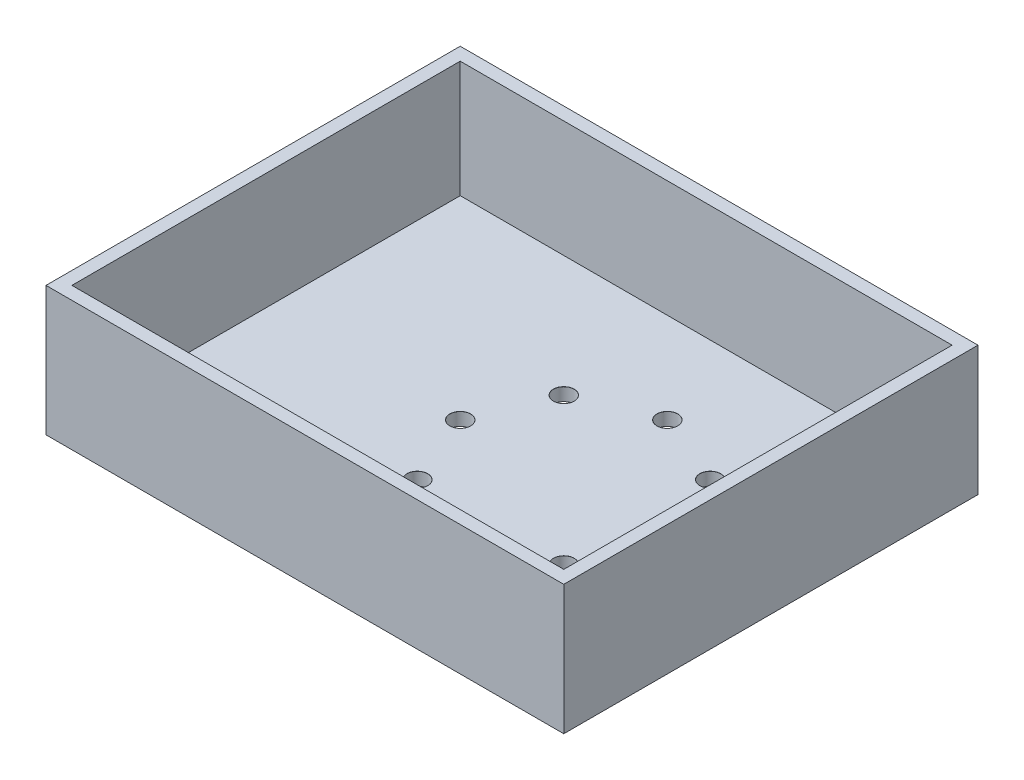
ISO-10303-21;
HEADER;
FILE_DESCRIPTION(('STEP AP214'),'2;1');
FILE_NAME('part.step','',(''),(''),'','','');
FILE_SCHEMA(('AUTOMOTIVE_DESIGN { 1 0 10303 214 1 1 1 1 }'));
ENDSEC;
DATA;
#1=APPLICATION_CONTEXT('core data for automotive mechanical design processes');
#2=APPLICATION_PROTOCOL_DEFINITION('international standard','automotive_design',2000,#1);
#3=PRODUCT_CONTEXT('',#1,'mechanical');
#4=PRODUCT('Part','Part','',(#3));
#5=PRODUCT_RELATED_PRODUCT_CATEGORY('part','',(#4));
#6=PRODUCT_DEFINITION_FORMATION('','',#4);
#7=PRODUCT_DEFINITION_CONTEXT('part definition',#1,'design');
#8=PRODUCT_DEFINITION('design','',#6,#7);
#9=PRODUCT_DEFINITION_SHAPE('','',#8);
#10=(LENGTH_UNIT() NAMED_UNIT(*) SI_UNIT(.MILLI.,.METRE.));
#11=(NAMED_UNIT(*) PLANE_ANGLE_UNIT() SI_UNIT($,.RADIAN.));
#12=(NAMED_UNIT(*) SI_UNIT($,.STERADIAN.) SOLID_ANGLE_UNIT());
#13=UNCERTAINTY_MEASURE_WITH_UNIT(LENGTH_MEASURE(1.E-05),#10,'distance_accuracy_value','');
#14=(GEOMETRIC_REPRESENTATION_CONTEXT(3) GLOBAL_UNCERTAINTY_ASSIGNED_CONTEXT((#13)) GLOBAL_UNIT_ASSIGNED_CONTEXT((#10,
#11,#12)) REPRESENTATION_CONTEXT('',''));
#15=CARTESIAN_POINT('',(0.,0.,0.));
#16=DIRECTION('',(0.,0.,1.));
#17=DIRECTION('',(1.,0.,0.));
#18=AXIS2_PLACEMENT_3D('',#15,#16,#17);
#19=CARTESIAN_POINT('',(0.,50.,160.));
#20=DIRECTION('',(0.,-1.,0.));
#21=DIRECTION('',(1.,0.,0.));
#22=AXIS2_PLACEMENT_3D('',#19,#20,#21);
#23=PLANE('',#22);
#24=DIRECTION('',(-1.,0.,0.));
#25=VECTOR('',#24,1.);
#26=CARTESIAN_POINT('',(0.,50.,0.));
#27=LINE('',#26,#25);
#28=CARTESIAN_POINT('',(0.,50.,0.));
#29=VERTEX_POINT('',#28);
#30=CARTESIAN_POINT('',(-200.,50.,0.));
#31=VERTEX_POINT('',#30);
#32=EDGE_CURVE('E168',#29,#31,#27,.T.);
#33=ORIENTED_EDGE('',*,*,#32,.T.);
#34=DIRECTION('',(0.,0.,-1.));
#35=VECTOR('',#34,1.);
#36=CARTESIAN_POINT('',(-200.,50.,160.));
#37=LINE('',#36,#35);
#38=CARTESIAN_POINT('',(-200.,50.,160.));
#39=VERTEX_POINT('',#38);
#40=EDGE_CURVE('E48',#39,#31,#37,.T.);
#41=ORIENTED_EDGE('',*,*,#40,.F.);
#42=DIRECTION('',(-1.,0.,0.));
#43=VECTOR('',#42,1.);
#44=CARTESIAN_POINT('',(0.,50.,160.));
#45=LINE('',#44,#43);
#46=CARTESIAN_POINT('',(0.,50.,160.));
#47=VERTEX_POINT('',#46);
#48=EDGE_CURVE('E92',#47,#39,#45,.T.);
#49=ORIENTED_EDGE('',*,*,#48,.F.);
#50=DIRECTION('',(0.,0.,-1.));
#51=VECTOR('',#50,1.);
#52=CARTESIAN_POINT('',(0.,50.,160.));
#53=LINE('',#52,#51);
#54=EDGE_CURVE('E11',#47,#29,#53,.T.);
#55=ORIENTED_EDGE('',*,*,#54,.T.);
#56=EDGE_LOOP('',(#33,#41,#49,#55));
#57=FACE_BOUND('',#56,.T.);
#58=DIRECTION('',(-1.,0.,0.));
#59=VECTOR('',#58,1.);
#60=CARTESIAN_POINT('',(0.,50.,5.));
#61=LINE('',#60,#59);
#62=CARTESIAN_POINT('',(-5.,50.,5.));
#63=VERTEX_POINT('',#62);
#64=CARTESIAN_POINT('',(-195.,50.,5.));
#65=VERTEX_POINT('',#64);
#66=EDGE_CURVE('E136',#63,#65,#61,.T.);
#67=ORIENTED_EDGE('',*,*,#66,.F.);
#68=DIRECTION('',(0.,0.,-1.));
#69=VECTOR('',#68,1.);
#70=CARTESIAN_POINT('',(-5.,50.,160.));
#71=LINE('',#70,#69);
#72=CARTESIAN_POINT('',(-5.,50.,155.));
#73=VERTEX_POINT('',#72);
#74=EDGE_CURVE('E135',#73,#63,#71,.T.);
#75=ORIENTED_EDGE('',*,*,#74,.F.);
#76=DIRECTION('',(-1.,0.,0.));
#77=VECTOR('',#76,1.);
#78=CARTESIAN_POINT('',(0.,50.,155.));
#79=LINE('',#78,#77);
#80=CARTESIAN_POINT('',(-195.,50.,155.));
#81=VERTEX_POINT('',#80);
#82=EDGE_CURVE('E145',#73,#81,#79,.T.);
#83=ORIENTED_EDGE('',*,*,#82,.T.);
#84=DIRECTION('',(0.,0.,-1.));
#85=VECTOR('',#84,1.);
#86=CARTESIAN_POINT('',(-195.,50.,160.));
#87=LINE('',#86,#85);
#88=EDGE_CURVE('E150',#81,#65,#87,.T.);
#89=ORIENTED_EDGE('',*,*,#88,.T.);
#90=EDGE_LOOP('',(#67,#75,#83,#89));
#91=FACE_BOUND('',#90,.T.);
#92=ADVANCED_FACE('F40',(#57,#91),#23,.F.);
#93=CARTESIAN_POINT('',(0.,0.,160.));
#94=DIRECTION('',(-1.,0.,0.));
#95=DIRECTION('',(0.,0.,1.));
#96=AXIS2_PLACEMENT_3D('',#93,#94,#95);
#97=PLANE('',#96);
#98=DIRECTION('',(0.,1.,0.));
#99=VECTOR('',#98,1.);
#100=CARTESIAN_POINT('',(0.,0.,0.));
#101=LINE('',#100,#99);
#102=CARTESIAN_POINT('',(0.,0.,0.));
#103=VERTEX_POINT('',#102);
#104=EDGE_CURVE('E153',#103,#29,#101,.T.);
#105=ORIENTED_EDGE('',*,*,#104,.T.);
#106=ORIENTED_EDGE('',*,*,#54,.F.);
#107=DIRECTION('',(0.,1.,0.));
#108=VECTOR('',#107,1.);
#109=CARTESIAN_POINT('',(0.,0.,160.));
#110=LINE('',#109,#108);
#111=CARTESIAN_POINT('',(0.,0.,160.));
#112=VERTEX_POINT('',#111);
#113=EDGE_CURVE('E159',#112,#47,#110,.T.);
#114=ORIENTED_EDGE('',*,*,#113,.F.);
#115=DIRECTION('',(0.,0.,-1.));
#116=VECTOR('',#115,1.);
#117=CARTESIAN_POINT('',(0.,0.,160.));
#118=LINE('',#117,#116);
#119=EDGE_CURVE('E165',#112,#103,#118,.T.);
#120=ORIENTED_EDGE('',*,*,#119,.T.);
#121=EDGE_LOOP('',(#105,#106,#114,#120));
#122=FACE_BOUND('',#121,.T.);
#123=ADVANCED_FACE('F42',(#122),#97,.F.);
#124=CARTESIAN_POINT('',(-200.,0.,160.));
#125=DIRECTION('',(1.,0.,0.));
#126=DIRECTION('',(0.,0.,-1.));
#127=AXIS2_PLACEMENT_3D('',#124,#125,#126);
#128=PLANE('',#127);
#129=DIRECTION('',(0.,-1.,0.));
#130=VECTOR('',#129,1.);
#131=CARTESIAN_POINT('',(-200.,0.,0.));
#132=LINE('',#131,#130);
#133=CARTESIAN_POINT('',(-200.,0.,0.));
#134=VERTEX_POINT('',#133);
#135=EDGE_CURVE('E170',#31,#134,#132,.T.);
#136=ORIENTED_EDGE('',*,*,#135,.T.);
#137=DIRECTION('',(0.,0.,-1.));
#138=VECTOR('',#137,1.);
#139=CARTESIAN_POINT('',(-200.,0.,160.));
#140=LINE('',#139,#138);
#141=CARTESIAN_POINT('',(-200.,0.,160.));
#142=VERTEX_POINT('',#141);
#143=EDGE_CURVE('E174',#142,#134,#140,.T.);
#144=ORIENTED_EDGE('',*,*,#143,.F.);
#145=DIRECTION('',(0.,-1.,0.));
#146=VECTOR('',#145,1.);
#147=CARTESIAN_POINT('',(-200.,0.,160.));
#148=LINE('',#147,#146);
#149=EDGE_CURVE('E162',#39,#142,#148,.T.);
#150=ORIENTED_EDGE('',*,*,#149,.F.);
#151=ORIENTED_EDGE('',*,*,#40,.T.);
#152=EDGE_LOOP('',(#136,#144,#150,#151));
#153=FACE_BOUND('',#152,.T.);
#154=ADVANCED_FACE('F179',(#153),#128,.F.);
#155=CARTESIAN_POINT('',(0.,0.,160.));
#156=DIRECTION('',(0.,1.,0.));
#157=DIRECTION('',(-1.,0.,0.));
#158=AXIS2_PLACEMENT_3D('',#155,#156,#157);
#159=PLANE('',#158);
#160=CARTESIAN_POINT('',(-108.284271247462,0.,51.7157287525378));
#161=DIRECTION('',(0.,1.,0.));
#162=DIRECTION('',(0.,0.,1.));
#163=AXIS2_PLACEMENT_3D('',#160,#161,#162);
#164=CIRCLE('',#163,4.);
#165=CARTESIAN_POINT('',(-108.284271247462,0.,55.7157287525378));
#166=VERTEX_POINT('',#165);
#167=EDGE_CURVE('E303',#166,#166,#164,.T.);
#168=ORIENTED_EDGE('',*,*,#167,.T.);
#169=EDGE_LOOP('',(#168));
#170=FACE_BOUND('',#169,.T.);
#171=CARTESIAN_POINT('',(-120.,0.,79.9999999999996));
#172=DIRECTION('',(0.,1.,0.));
#173=DIRECTION('',(0.,0.,1.));
#174=AXIS2_PLACEMENT_3D('',#171,#172,#173);
#175=CIRCLE('',#174,4.);
#176=CARTESIAN_POINT('',(-120.,0.,83.9999999999996));
#177=VERTEX_POINT('',#176);
#178=EDGE_CURVE('E313',#177,#177,#175,.T.);
#179=ORIENTED_EDGE('',*,*,#178,.T.);
#180=EDGE_LOOP('',(#179));
#181=FACE_BOUND('',#180,.T.);
#182=CARTESIAN_POINT('',(-108.284271247462,0.,108.284271247462));
#183=DIRECTION('',(0.,1.,0.));
#184=DIRECTION('',(0.,0.,1.));
#185=AXIS2_PLACEMENT_3D('',#182,#183,#184);
#186=CIRCLE('',#185,4.);
#187=CARTESIAN_POINT('',(-108.284271247462,0.,112.284271247462));
#188=VERTEX_POINT('',#187);
#189=EDGE_CURVE('E322',#188,#188,#186,.T.);
#190=ORIENTED_EDGE('',*,*,#189,.T.);
#191=EDGE_LOOP('',(#190));
#192=FACE_BOUND('',#191,.T.);
#193=CARTESIAN_POINT('',(-80.,0.,120.));
#194=DIRECTION('',(0.,1.,0.));
#195=DIRECTION('',(0.,0.,1.));
#196=AXIS2_PLACEMENT_3D('',#193,#194,#195);
#197=CIRCLE('',#196,4.);
#198=CARTESIAN_POINT('',(-80.,0.,124.));
#199=VERTEX_POINT('',#198);
#200=EDGE_CURVE('E331',#199,#199,#197,.T.);
#201=ORIENTED_EDGE('',*,*,#200,.T.);
#202=EDGE_LOOP('',(#201));
#203=FACE_BOUND('',#202,.T.);
#204=CARTESIAN_POINT('',(-51.7157287525382,0.,108.284271247462));
#205=DIRECTION('',(0.,1.,0.));
#206=DIRECTION('',(0.,0.,1.));
#207=AXIS2_PLACEMENT_3D('',#204,#205,#206);
#208=CIRCLE('',#207,4.);
#209=CARTESIAN_POINT('',(-51.7157287525382,0.,112.284271247462));
#210=VERTEX_POINT('',#209);
#211=EDGE_CURVE('E340',#210,#210,#208,.T.);
#212=ORIENTED_EDGE('',*,*,#211,.T.);
#213=EDGE_LOOP('',(#212));
#214=FACE_BOUND('',#213,.T.);
#215=CARTESIAN_POINT('',(-40.,0.,80.0000000000001));
#216=DIRECTION('',(0.,1.,0.));
#217=DIRECTION('',(0.,0.,1.));
#218=AXIS2_PLACEMENT_3D('',#215,#216,#217);
#219=CIRCLE('',#218,4.);
#220=CARTESIAN_POINT('',(-40.,0.,84.0000000000001));
#221=VERTEX_POINT('',#220);
#222=EDGE_CURVE('E349',#221,#221,#219,.T.);
#223=ORIENTED_EDGE('',*,*,#222,.T.);
#224=EDGE_LOOP('',(#223));
#225=FACE_BOUND('',#224,.T.);
#226=CARTESIAN_POINT('',(-51.715728752538,0.,51.7157287525381));
#227=DIRECTION('',(0.,1.,0.));
#228=DIRECTION('',(0.,0.,1.));
#229=AXIS2_PLACEMENT_3D('',#226,#227,#228);
#230=CIRCLE('',#229,4.);
#231=CARTESIAN_POINT('',(-51.715728752538,0.,55.7157287525381));
#232=VERTEX_POINT('',#231);
#233=EDGE_CURVE('E358',#232,#232,#230,.T.);
#234=ORIENTED_EDGE('',*,*,#233,.T.);
#235=EDGE_LOOP('',(#234));
#236=FACE_BOUND('',#235,.T.);
#237=CARTESIAN_POINT('',(-80.,0.,40.));
#238=DIRECTION('',(0.,1.,0.));
#239=DIRECTION('',(0.,0.,1.));
#240=AXIS2_PLACEMENT_3D('',#237,#238,#239);
#241=CIRCLE('',#240,4.);
#242=CARTESIAN_POINT('',(-80.,0.,44.));
#243=VERTEX_POINT('',#242);
#244=EDGE_CURVE('E137',#243,#243,#241,.T.);
#245=ORIENTED_EDGE('',*,*,#244,.T.);
#246=EDGE_LOOP('',(#245));
#247=FACE_BOUND('',#246,.T.);
#248=DIRECTION('',(1.,0.,0.));
#249=VECTOR('',#248,1.);
#250=CARTESIAN_POINT('',(0.,0.,0.));
#251=LINE('',#250,#249);
#252=EDGE_CURVE('E85',#134,#103,#251,.T.);
#253=ORIENTED_EDGE('',*,*,#252,.T.);
#254=ORIENTED_EDGE('',*,*,#119,.F.);
#255=DIRECTION('',(1.,0.,0.));
#256=VECTOR('',#255,1.);
#257=CARTESIAN_POINT('',(0.,0.,160.));
#258=LINE('',#257,#256);
#259=EDGE_CURVE('E64',#142,#112,#258,.T.);
#260=ORIENTED_EDGE('',*,*,#259,.F.);
#261=ORIENTED_EDGE('',*,*,#143,.T.);
#262=EDGE_LOOP('',(#253,#254,#260,#261));
#263=FACE_BOUND('',#262,.T.);
#264=ADVANCED_FACE('F187',(#170,#181,#192,#203,#214,#225,#236,#247,#263),#159,.F.);
#265=CARTESIAN_POINT('',(0.,0.,160.));
#266=DIRECTION('',(0.,0.,1.));
#267=DIRECTION('',(1.,0.,0.));
#268=AXIS2_PLACEMENT_3D('',#265,#266,#267);
#269=PLANE('',#268);
#270=ORIENTED_EDGE('',*,*,#113,.T.);
#271=ORIENTED_EDGE('',*,*,#48,.T.);
#272=ORIENTED_EDGE('',*,*,#149,.T.);
#273=ORIENTED_EDGE('',*,*,#259,.T.);
#274=EDGE_LOOP('',(#270,#271,#272,#273));
#275=FACE_BOUND('',#274,.T.);
#276=ADVANCED_FACE('F189',(#275),#269,.T.);
#277=CARTESIAN_POINT('',(0.,0.,0.));
#278=DIRECTION('',(0.,0.,1.));
#279=DIRECTION('',(1.,0.,0.));
#280=AXIS2_PLACEMENT_3D('',#277,#278,#279);
#281=PLANE('',#280);
#282=ORIENTED_EDGE('',*,*,#104,.F.);
#283=ORIENTED_EDGE('',*,*,#252,.F.);
#284=ORIENTED_EDGE('',*,*,#135,.F.);
#285=ORIENTED_EDGE('',*,*,#32,.F.);
#286=EDGE_LOOP('',(#282,#283,#284,#285));
#287=FACE_BOUND('',#286,.T.);
#288=ADVANCED_FACE('F183',(#287),#281,.F.);
#289=CARTESIAN_POINT('',(-5.,0.,160.));
#290=DIRECTION('',(-1.,0.,0.));
#291=DIRECTION('',(0.,0.,1.));
#292=AXIS2_PLACEMENT_3D('',#289,#290,#291);
#293=PLANE('',#292);
#294=DIRECTION('',(0.,1.,0.));
#295=VECTOR('',#294,1.);
#296=CARTESIAN_POINT('',(-5.,0.,5.));
#297=LINE('',#296,#295);
#298=CARTESIAN_POINT('',(-5.,5.,5.));
#299=VERTEX_POINT('',#298);
#300=EDGE_CURVE('E119',#299,#63,#297,.T.);
#301=ORIENTED_EDGE('',*,*,#300,.F.);
#302=DIRECTION('',(0.,0.,-1.));
#303=VECTOR('',#302,1.);
#304=CARTESIAN_POINT('',(-5.,5.,160.));
#305=LINE('',#304,#303);
#306=CARTESIAN_POINT('',(-5.,5.,155.));
#307=VERTEX_POINT('',#306);
#308=EDGE_CURVE('E127',#307,#299,#305,.T.);
#309=ORIENTED_EDGE('',*,*,#308,.F.);
#310=DIRECTION('',(0.,1.,0.));
#311=VECTOR('',#310,1.);
#312=CARTESIAN_POINT('',(-5.,0.,155.));
#313=LINE('',#312,#311);
#314=EDGE_CURVE('E55',#307,#73,#313,.T.);
#315=ORIENTED_EDGE('',*,*,#314,.T.);
#316=ORIENTED_EDGE('',*,*,#74,.T.);
#317=EDGE_LOOP('',(#301,#309,#315,#316));
#318=FACE_BOUND('',#317,.T.);
#319=ADVANCED_FACE('F133',(#318),#293,.T.);
#320=CARTESIAN_POINT('',(-195.,0.,160.));
#321=DIRECTION('',(1.,0.,0.));
#322=DIRECTION('',(0.,0.,-1.));
#323=AXIS2_PLACEMENT_3D('',#320,#321,#322);
#324=PLANE('',#323);
#325=DIRECTION('',(0.,-1.,0.));
#326=VECTOR('',#325,1.);
#327=CARTESIAN_POINT('',(-195.,0.,5.));
#328=LINE('',#327,#326);
#329=CARTESIAN_POINT('',(-195.,4.99999999999998,5.));
#330=VERTEX_POINT('',#329);
#331=EDGE_CURVE('E122',#65,#330,#328,.T.);
#332=ORIENTED_EDGE('',*,*,#331,.F.);
#333=ORIENTED_EDGE('',*,*,#88,.F.);
#334=DIRECTION('',(0.,-1.,0.));
#335=VECTOR('',#334,1.);
#336=CARTESIAN_POINT('',(-195.,0.,155.));
#337=LINE('',#336,#335);
#338=CARTESIAN_POINT('',(-195.,4.99999999999998,155.));
#339=VERTEX_POINT('',#338);
#340=EDGE_CURVE('E148',#81,#339,#337,.T.);
#341=ORIENTED_EDGE('',*,*,#340,.T.);
#342=DIRECTION('',(0.,0.,-1.));
#343=VECTOR('',#342,1.);
#344=CARTESIAN_POINT('',(-195.,4.99999999999998,160.));
#345=LINE('',#344,#343);
#346=EDGE_CURVE('E131',#339,#330,#345,.T.);
#347=ORIENTED_EDGE('',*,*,#346,.T.);
#348=EDGE_LOOP('',(#332,#333,#341,#347));
#349=FACE_BOUND('',#348,.T.);
#350=ADVANCED_FACE('F207',(#349),#324,.T.);
#351=CARTESIAN_POINT('',(0.,5.,160.));
#352=DIRECTION('',(0.,1.,0.));
#353=DIRECTION('',(-1.,0.,0.));
#354=AXIS2_PLACEMENT_3D('',#351,#352,#353);
#355=PLANE('',#354);
#356=CARTESIAN_POINT('',(-108.284271247462,4.99999999999999,51.7157287525378));
#357=DIRECTION('',(0.,1.,0.));
#358=DIRECTION('',(0.,0.,1.));
#359=AXIS2_PLACEMENT_3D('',#356,#357,#358);
#360=CIRCLE('',#359,4.025);
#361=CARTESIAN_POINT('',(-108.284271247462,4.99999999999999,55.7407287525378));
#362=VERTEX_POINT('',#361);
#363=EDGE_CURVE('E301',#362,#362,#360,.T.);
#364=ORIENTED_EDGE('',*,*,#363,.F.);
#365=EDGE_LOOP('',(#364));
#366=FACE_BOUND('',#365,.T.);
#367=CARTESIAN_POINT('',(-120.,4.99999999999999,79.9999999999996));
#368=DIRECTION('',(0.,1.,0.));
#369=DIRECTION('',(0.,0.,1.));
#370=AXIS2_PLACEMENT_3D('',#367,#368,#369);
#371=CIRCLE('',#370,4.025);
#372=CARTESIAN_POINT('',(-120.,4.99999999999999,84.0249999999996));
#373=VERTEX_POINT('',#372);
#374=EDGE_CURVE('E307',#373,#373,#371,.T.);
#375=ORIENTED_EDGE('',*,*,#374,.F.);
#376=EDGE_LOOP('',(#375));
#377=FACE_BOUND('',#376,.T.);
#378=CARTESIAN_POINT('',(-108.284271247462,4.99999999999999,108.284271247462));
#379=DIRECTION('',(0.,1.,0.));
#380=DIRECTION('',(0.,0.,1.));
#381=AXIS2_PLACEMENT_3D('',#378,#379,#380);
#382=CIRCLE('',#381,4.025);
#383=CARTESIAN_POINT('',(-108.284271247462,4.99999999999999,112.309271247462));
#384=VERTEX_POINT('',#383);
#385=EDGE_CURVE('E316',#384,#384,#382,.T.);
#386=ORIENTED_EDGE('',*,*,#385,.F.);
#387=EDGE_LOOP('',(#386));
#388=FACE_BOUND('',#387,.T.);
#389=CARTESIAN_POINT('',(-80.,4.99999999999999,120.));
#390=DIRECTION('',(0.,1.,0.));
#391=DIRECTION('',(0.,0.,1.));
#392=AXIS2_PLACEMENT_3D('',#389,#390,#391);
#393=CIRCLE('',#392,4.025);
#394=CARTESIAN_POINT('',(-80.,4.99999999999999,124.025));
#395=VERTEX_POINT('',#394);
#396=EDGE_CURVE('E325',#395,#395,#393,.T.);
#397=ORIENTED_EDGE('',*,*,#396,.F.);
#398=EDGE_LOOP('',(#397));
#399=FACE_BOUND('',#398,.T.);
#400=CARTESIAN_POINT('',(-51.7157287525382,4.99999999999999,108.284271247462));
#401=DIRECTION('',(0.,1.,0.));
#402=DIRECTION('',(0.,0.,1.));
#403=AXIS2_PLACEMENT_3D('',#400,#401,#402);
#404=CIRCLE('',#403,4.025);
#405=CARTESIAN_POINT('',(-51.7157287525382,4.99999999999999,112.309271247462));
#406=VERTEX_POINT('',#405);
#407=EDGE_CURVE('E334',#406,#406,#404,.T.);
#408=ORIENTED_EDGE('',*,*,#407,.F.);
#409=EDGE_LOOP('',(#408));
#410=FACE_BOUND('',#409,.T.);
#411=CARTESIAN_POINT('',(-40.,4.99999999999999,80.0000000000001));
#412=DIRECTION('',(0.,1.,0.));
#413=DIRECTION('',(0.,0.,1.));
#414=AXIS2_PLACEMENT_3D('',#411,#412,#413);
#415=CIRCLE('',#414,4.025);
#416=CARTESIAN_POINT('',(-40.,4.99999999999999,84.0250000000001));
#417=VERTEX_POINT('',#416);
#418=EDGE_CURVE('E343',#417,#417,#415,.T.);
#419=ORIENTED_EDGE('',*,*,#418,.F.);
#420=EDGE_LOOP('',(#419));
#421=FACE_BOUND('',#420,.T.);
#422=CARTESIAN_POINT('',(-51.715728752538,4.99999999999999,51.7157287525381));
#423=DIRECTION('',(0.,1.,0.));
#424=DIRECTION('',(0.,0.,1.));
#425=AXIS2_PLACEMENT_3D('',#422,#423,#424);
#426=CIRCLE('',#425,4.025);
#427=CARTESIAN_POINT('',(-51.715728752538,4.99999999999999,55.7407287525381));
#428=VERTEX_POINT('',#427);
#429=EDGE_CURVE('E352',#428,#428,#426,.T.);
#430=ORIENTED_EDGE('',*,*,#429,.F.);
#431=EDGE_LOOP('',(#430));
#432=FACE_BOUND('',#431,.T.);
#433=CARTESIAN_POINT('',(-80.,4.99999999999999,40.));
#434=DIRECTION('',(0.,1.,0.));
#435=DIRECTION('',(0.,0.,1.));
#436=AXIS2_PLACEMENT_3D('',#433,#434,#435);
#437=CIRCLE('',#436,4.025);
#438=CARTESIAN_POINT('',(-80.,4.99999999999999,44.025));
#439=VERTEX_POINT('',#438);
#440=EDGE_CURVE('E361',#439,#439,#437,.T.);
#441=ORIENTED_EDGE('',*,*,#440,.F.);
#442=EDGE_LOOP('',(#441));
#443=FACE_BOUND('',#442,.T.);
#444=DIRECTION('',(1.,0.,0.));
#445=VECTOR('',#444,1.);
#446=CARTESIAN_POINT('',(0.,5.,5.));
#447=LINE('',#446,#445);
#448=EDGE_CURVE('E115',#330,#299,#447,.T.);
#449=ORIENTED_EDGE('',*,*,#448,.F.);
#450=ORIENTED_EDGE('',*,*,#346,.F.);
#451=DIRECTION('',(1.,0.,0.));
#452=VECTOR('',#451,1.);
#453=CARTESIAN_POINT('',(0.,5.,155.));
#454=LINE('',#453,#452);
#455=EDGE_CURVE('E130',#339,#307,#454,.T.);
#456=ORIENTED_EDGE('',*,*,#455,.T.);
#457=ORIENTED_EDGE('',*,*,#308,.T.);
#458=EDGE_LOOP('',(#449,#450,#456,#457));
#459=FACE_BOUND('',#458,.T.);
#460=ADVANCED_FACE('F128',(#366,#377,#388,#399,#410,#421,#432,#443,#459),#355,.T.);
#461=CARTESIAN_POINT('',(0.,0.,155.));
#462=DIRECTION('',(0.,0.,1.));
#463=DIRECTION('',(1.,0.,0.));
#464=AXIS2_PLACEMENT_3D('',#461,#462,#463);
#465=PLANE('',#464);
#466=ORIENTED_EDGE('',*,*,#314,.F.);
#467=ORIENTED_EDGE('',*,*,#455,.F.);
#468=ORIENTED_EDGE('',*,*,#340,.F.);
#469=ORIENTED_EDGE('',*,*,#82,.F.);
#470=EDGE_LOOP('',(#466,#467,#468,#469));
#471=FACE_BOUND('',#470,.T.);
#472=ADVANCED_FACE('F210',(#471),#465,.F.);
#473=CARTESIAN_POINT('',(0.,0.,5.));
#474=DIRECTION('',(0.,0.,1.));
#475=DIRECTION('',(1.,0.,0.));
#476=AXIS2_PLACEMENT_3D('',#473,#474,#475);
#477=PLANE('',#476);
#478=ORIENTED_EDGE('',*,*,#300,.T.);
#479=ORIENTED_EDGE('',*,*,#66,.T.);
#480=ORIENTED_EDGE('',*,*,#331,.T.);
#481=ORIENTED_EDGE('',*,*,#448,.T.);
#482=EDGE_LOOP('',(#478,#479,#480,#481));
#483=FACE_BOUND('',#482,.T.);
#484=ADVANCED_FACE('F117',(#483),#477,.T.);
#485=CARTESIAN_POINT('',(-80.,4.99999999999999,40.));
#486=DIRECTION('',(0.,1.,0.));
#487=DIRECTION('',(0.,0.,1.));
#488=AXIS2_PLACEMENT_3D('',#485,#486,#487);
#489=CYLINDRICAL_SURFACE('',#488,4.);
#490=ORIENTED_EDGE('',*,*,#244,.F.);
#491=EDGE_LOOP('',(#490));
#492=FACE_BOUND('',#491,.T.);
#493=CARTESIAN_POINT('',(-80.,4.97902250922056,40.));
#494=DIRECTION('',(0.,1.,0.));
#495=DIRECTION('',(0.,0.,1.));
#496=AXIS2_PLACEMENT_3D('',#493,#494,#495);
#497=CIRCLE('',#496,4.);
#498=CARTESIAN_POINT('',(-80.,4.97902250922056,44.));
#499=VERTEX_POINT('',#498);
#500=EDGE_CURVE('E141',#499,#499,#497,.T.);
#501=ORIENTED_EDGE('',*,*,#500,.T.);
#502=EDGE_LOOP('',(#501));
#503=FACE_BOUND('',#502,.T.);
#504=ADVANCED_FACE('F217',(#492,#503),#489,.F.);
#505=CARTESIAN_POINT('',(-80.,4.99999999999999,40.));
#506=DIRECTION('',(0.,1.,0.));
#507=DIRECTION('',(0.,0.,1.));
#508=AXIS2_PLACEMENT_3D('',#505,#506,#507);
#509=CONICAL_SURFACE('',#508,4.025,0.87266462599707);
#510=ORIENTED_EDGE('',*,*,#500,.F.);
#511=EDGE_LOOP('',(#510));
#512=FACE_BOUND('',#511,.T.);
#513=ORIENTED_EDGE('',*,*,#440,.T.);
#514=EDGE_LOOP('',(#513));
#515=FACE_BOUND('',#514,.T.);
#516=ADVANCED_FACE('F233',(#512,#515),#509,.F.);
#517=CARTESIAN_POINT('',(-51.715728752538,4.99999999999999,51.7157287525381));
#518=DIRECTION('',(0.,1.,0.));
#519=DIRECTION('',(0.,0.,1.));
#520=AXIS2_PLACEMENT_3D('',#517,#518,#519);
#521=CYLINDRICAL_SURFACE('',#520,4.);
#522=ORIENTED_EDGE('',*,*,#233,.F.);
#523=EDGE_LOOP('',(#522));
#524=FACE_BOUND('',#523,.T.);
#525=CARTESIAN_POINT('',(-51.715728752538,4.97902250922056,51.7157287525381));
#526=DIRECTION('',(0.,1.,0.));
#527=DIRECTION('',(0.,0.,1.));
#528=AXIS2_PLACEMENT_3D('',#525,#526,#527);
#529=CIRCLE('',#528,4.);
#530=CARTESIAN_POINT('',(-51.715728752538,4.97902250922056,55.7157287525381));
#531=VERTEX_POINT('',#530);
#532=EDGE_CURVE('E355',#531,#531,#529,.T.);
#533=ORIENTED_EDGE('',*,*,#532,.T.);
#534=EDGE_LOOP('',(#533));
#535=FACE_BOUND('',#534,.T.);
#536=ADVANCED_FACE('F237',(#524,#535),#521,.F.);
#537=CARTESIAN_POINT('',(-51.715728752538,4.99999999999999,51.7157287525381));
#538=DIRECTION('',(0.,1.,0.));
#539=DIRECTION('',(0.,0.,1.));
#540=AXIS2_PLACEMENT_3D('',#537,#538,#539);
#541=CONICAL_SURFACE('',#540,4.025,0.87266462599707);
#542=ORIENTED_EDGE('',*,*,#532,.F.);
#543=EDGE_LOOP('',(#542));
#544=FACE_BOUND('',#543,.T.);
#545=ORIENTED_EDGE('',*,*,#429,.T.);
#546=EDGE_LOOP('',(#545));
#547=FACE_BOUND('',#546,.T.);
#548=ADVANCED_FACE('F241',(#544,#547),#541,.F.);
#549=CARTESIAN_POINT('',(-40.,4.99999999999999,80.0000000000001));
#550=DIRECTION('',(0.,1.,0.));
#551=DIRECTION('',(0.,0.,1.));
#552=AXIS2_PLACEMENT_3D('',#549,#550,#551);
#553=CYLINDRICAL_SURFACE('',#552,4.);
#554=ORIENTED_EDGE('',*,*,#222,.F.);
#555=EDGE_LOOP('',(#554));
#556=FACE_BOUND('',#555,.T.);
#557=CARTESIAN_POINT('',(-40.,4.97902250922056,80.0000000000001));
#558=DIRECTION('',(0.,1.,0.));
#559=DIRECTION('',(0.,0.,1.));
#560=AXIS2_PLACEMENT_3D('',#557,#558,#559);
#561=CIRCLE('',#560,4.);
#562=CARTESIAN_POINT('',(-40.,4.97902250922056,84.0000000000001));
#563=VERTEX_POINT('',#562);
#564=EDGE_CURVE('E346',#563,#563,#561,.T.);
#565=ORIENTED_EDGE('',*,*,#564,.T.);
#566=EDGE_LOOP('',(#565));
#567=FACE_BOUND('',#566,.T.);
#568=ADVANCED_FACE('F245',(#556,#567),#553,.F.);
#569=CARTESIAN_POINT('',(-40.,4.99999999999999,80.0000000000001));
#570=DIRECTION('',(0.,1.,0.));
#571=DIRECTION('',(0.,0.,1.));
#572=AXIS2_PLACEMENT_3D('',#569,#570,#571);
#573=CONICAL_SURFACE('',#572,4.025,0.87266462599707);
#574=ORIENTED_EDGE('',*,*,#564,.F.);
#575=EDGE_LOOP('',(#574));
#576=FACE_BOUND('',#575,.T.);
#577=ORIENTED_EDGE('',*,*,#418,.T.);
#578=EDGE_LOOP('',(#577));
#579=FACE_BOUND('',#578,.T.);
#580=ADVANCED_FACE('F249',(#576,#579),#573,.F.);
#581=CARTESIAN_POINT('',(-51.7157287525382,4.99999999999999,108.284271247462));
#582=DIRECTION('',(0.,1.,0.));
#583=DIRECTION('',(0.,0.,1.));
#584=AXIS2_PLACEMENT_3D('',#581,#582,#583);
#585=CYLINDRICAL_SURFACE('',#584,4.);
#586=ORIENTED_EDGE('',*,*,#211,.F.);
#587=EDGE_LOOP('',(#586));
#588=FACE_BOUND('',#587,.T.);
#589=CARTESIAN_POINT('',(-51.7157287525382,4.97902250922056,108.284271247462));
#590=DIRECTION('',(0.,1.,0.));
#591=DIRECTION('',(0.,0.,1.));
#592=AXIS2_PLACEMENT_3D('',#589,#590,#591);
#593=CIRCLE('',#592,4.);
#594=CARTESIAN_POINT('',(-51.7157287525382,4.97902250922056,112.284271247462));
#595=VERTEX_POINT('',#594);
#596=EDGE_CURVE('E337',#595,#595,#593,.T.);
#597=ORIENTED_EDGE('',*,*,#596,.T.);
#598=EDGE_LOOP('',(#597));
#599=FACE_BOUND('',#598,.T.);
#600=ADVANCED_FACE('F253',(#588,#599),#585,.F.);
#601=CARTESIAN_POINT('',(-51.7157287525382,4.99999999999999,108.284271247462));
#602=DIRECTION('',(0.,1.,0.));
#603=DIRECTION('',(0.,0.,1.));
#604=AXIS2_PLACEMENT_3D('',#601,#602,#603);
#605=CONICAL_SURFACE('',#604,4.025,0.87266462599707);
#606=ORIENTED_EDGE('',*,*,#596,.F.);
#607=EDGE_LOOP('',(#606));
#608=FACE_BOUND('',#607,.T.);
#609=ORIENTED_EDGE('',*,*,#407,.T.);
#610=EDGE_LOOP('',(#609));
#611=FACE_BOUND('',#610,.T.);
#612=ADVANCED_FACE('F257',(#608,#611),#605,.F.);
#613=CARTESIAN_POINT('',(-80.,4.99999999999999,120.));
#614=DIRECTION('',(0.,1.,0.));
#615=DIRECTION('',(0.,0.,1.));
#616=AXIS2_PLACEMENT_3D('',#613,#614,#615);
#617=CYLINDRICAL_SURFACE('',#616,4.);
#618=ORIENTED_EDGE('',*,*,#200,.F.);
#619=EDGE_LOOP('',(#618));
#620=FACE_BOUND('',#619,.T.);
#621=CARTESIAN_POINT('',(-80.,4.97902250922056,120.));
#622=DIRECTION('',(0.,1.,0.));
#623=DIRECTION('',(0.,0.,1.));
#624=AXIS2_PLACEMENT_3D('',#621,#622,#623);
#625=CIRCLE('',#624,4.);
#626=CARTESIAN_POINT('',(-80.,4.97902250922056,124.));
#627=VERTEX_POINT('',#626);
#628=EDGE_CURVE('E328',#627,#627,#625,.T.);
#629=ORIENTED_EDGE('',*,*,#628,.T.);
#630=EDGE_LOOP('',(#629));
#631=FACE_BOUND('',#630,.T.);
#632=ADVANCED_FACE('F261',(#620,#631),#617,.F.);
#633=CARTESIAN_POINT('',(-80.,4.99999999999999,120.));
#634=DIRECTION('',(0.,1.,0.));
#635=DIRECTION('',(0.,0.,1.));
#636=AXIS2_PLACEMENT_3D('',#633,#634,#635);
#637=CONICAL_SURFACE('',#636,4.025,0.87266462599707);
#638=ORIENTED_EDGE('',*,*,#628,.F.);
#639=EDGE_LOOP('',(#638));
#640=FACE_BOUND('',#639,.T.);
#641=ORIENTED_EDGE('',*,*,#396,.T.);
#642=EDGE_LOOP('',(#641));
#643=FACE_BOUND('',#642,.T.);
#644=ADVANCED_FACE('F265',(#640,#643),#637,.F.);
#645=CARTESIAN_POINT('',(-108.284271247462,4.99999999999999,108.284271247462));
#646=DIRECTION('',(0.,1.,0.));
#647=DIRECTION('',(0.,0.,1.));
#648=AXIS2_PLACEMENT_3D('',#645,#646,#647);
#649=CYLINDRICAL_SURFACE('',#648,4.);
#650=ORIENTED_EDGE('',*,*,#189,.F.);
#651=EDGE_LOOP('',(#650));
#652=FACE_BOUND('',#651,.T.);
#653=CARTESIAN_POINT('',(-108.284271247462,4.97902250922056,108.284271247462));
#654=DIRECTION('',(0.,1.,0.));
#655=DIRECTION('',(0.,0.,1.));
#656=AXIS2_PLACEMENT_3D('',#653,#654,#655);
#657=CIRCLE('',#656,4.);
#658=CARTESIAN_POINT('',(-108.284271247462,4.97902250922056,112.284271247462));
#659=VERTEX_POINT('',#658);
#660=EDGE_CURVE('E319',#659,#659,#657,.T.);
#661=ORIENTED_EDGE('',*,*,#660,.T.);
#662=EDGE_LOOP('',(#661));
#663=FACE_BOUND('',#662,.T.);
#664=ADVANCED_FACE('F269',(#652,#663),#649,.F.);
#665=CARTESIAN_POINT('',(-108.284271247462,4.99999999999999,108.284271247462));
#666=DIRECTION('',(0.,1.,0.));
#667=DIRECTION('',(0.,0.,1.));
#668=AXIS2_PLACEMENT_3D('',#665,#666,#667);
#669=CONICAL_SURFACE('',#668,4.025,0.87266462599707);
#670=ORIENTED_EDGE('',*,*,#660,.F.);
#671=EDGE_LOOP('',(#670));
#672=FACE_BOUND('',#671,.T.);
#673=ORIENTED_EDGE('',*,*,#385,.T.);
#674=EDGE_LOOP('',(#673));
#675=FACE_BOUND('',#674,.T.);
#676=ADVANCED_FACE('F273',(#672,#675),#669,.F.);
#677=CARTESIAN_POINT('',(-120.,4.99999999999999,79.9999999999996));
#678=DIRECTION('',(0.,1.,0.));
#679=DIRECTION('',(0.,0.,1.));
#680=AXIS2_PLACEMENT_3D('',#677,#678,#679);
#681=CYLINDRICAL_SURFACE('',#680,4.);
#682=ORIENTED_EDGE('',*,*,#178,.F.);
#683=EDGE_LOOP('',(#682));
#684=FACE_BOUND('',#683,.T.);
#685=CARTESIAN_POINT('',(-120.,4.97902250922056,79.9999999999996));
#686=DIRECTION('',(0.,1.,0.));
#687=DIRECTION('',(0.,0.,1.));
#688=AXIS2_PLACEMENT_3D('',#685,#686,#687);
#689=CIRCLE('',#688,4.);
#690=CARTESIAN_POINT('',(-120.,4.97902250922056,83.9999999999996));
#691=VERTEX_POINT('',#690);
#692=EDGE_CURVE('E310',#691,#691,#689,.T.);
#693=ORIENTED_EDGE('',*,*,#692,.T.);
#694=EDGE_LOOP('',(#693));
#695=FACE_BOUND('',#694,.T.);
#696=ADVANCED_FACE('F277',(#684,#695),#681,.F.);
#697=CARTESIAN_POINT('',(-120.,4.99999999999999,79.9999999999996));
#698=DIRECTION('',(0.,1.,0.));
#699=DIRECTION('',(0.,0.,1.));
#700=AXIS2_PLACEMENT_3D('',#697,#698,#699);
#701=CONICAL_SURFACE('',#700,4.025,0.87266462599707);
#702=ORIENTED_EDGE('',*,*,#692,.F.);
#703=EDGE_LOOP('',(#702));
#704=FACE_BOUND('',#703,.T.);
#705=ORIENTED_EDGE('',*,*,#374,.T.);
#706=EDGE_LOOP('',(#705));
#707=FACE_BOUND('',#706,.T.);
#708=ADVANCED_FACE('F281',(#704,#707),#701,.F.);
#709=CARTESIAN_POINT('',(-108.284271247462,4.99999999999999,51.7157287525378));
#710=DIRECTION('',(0.,1.,0.));
#711=DIRECTION('',(0.,0.,1.));
#712=AXIS2_PLACEMENT_3D('',#709,#710,#711);
#713=CYLINDRICAL_SURFACE('',#712,4.);
#714=ORIENTED_EDGE('',*,*,#167,.F.);
#715=EDGE_LOOP('',(#714));
#716=FACE_BOUND('',#715,.T.);
#717=CARTESIAN_POINT('',(-108.284271247462,4.97902250922056,51.7157287525378));
#718=DIRECTION('',(0.,1.,0.));
#719=DIRECTION('',(0.,0.,1.));
#720=AXIS2_PLACEMENT_3D('',#717,#718,#719);
#721=CIRCLE('',#720,4.);
#722=CARTESIAN_POINT('',(-108.284271247462,4.97902250922056,55.7157287525378));
#723=VERTEX_POINT('',#722);
#724=EDGE_CURVE('E298',#723,#723,#721,.T.);
#725=ORIENTED_EDGE('',*,*,#724,.T.);
#726=EDGE_LOOP('',(#725));
#727=FACE_BOUND('',#726,.T.);
#728=ADVANCED_FACE('F285',(#716,#727),#713,.F.);
#729=CARTESIAN_POINT('',(-108.284271247462,4.99999999999999,51.7157287525378));
#730=DIRECTION('',(0.,1.,0.));
#731=DIRECTION('',(0.,0.,1.));
#732=AXIS2_PLACEMENT_3D('',#729,#730,#731);
#733=CONICAL_SURFACE('',#732,4.025,0.87266462599707);
#734=ORIENTED_EDGE('',*,*,#724,.F.);
#735=EDGE_LOOP('',(#734));
#736=FACE_BOUND('',#735,.T.);
#737=ORIENTED_EDGE('',*,*,#363,.T.);
#738=EDGE_LOOP('',(#737));
#739=FACE_BOUND('',#738,.T.);
#740=ADVANCED_FACE('F289',(#736,#739),#733,.F.);
#741=CLOSED_SHELL('',(#92,#123,#154,#264,#276,#288,#319,#350,#460,#472,#484,#504,#516,#536,#548,
#568,#580,#600,#612,#632,#644,#664,#676,#696,#708,#728,#740));
#742=MANIFOLD_SOLID_BREP('B2',#741);
#743=ADVANCED_BREP_SHAPE_REPRESENTATION('',(#18,#742),#14);
#744=SHAPE_DEFINITION_REPRESENTATION(#9,#743);
ENDSEC;
END-ISO-10303-21;
